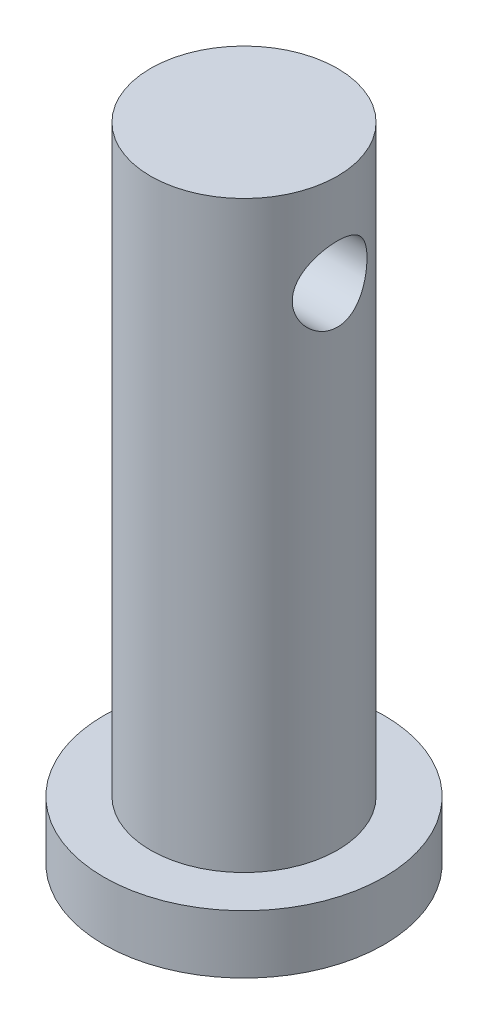
ISO-10303-21;
HEADER;
FILE_DESCRIPTION(('STEP AP214'),'2;1');
FILE_NAME('part.step','',(''),(''),'','','');
FILE_SCHEMA(('AUTOMOTIVE_DESIGN { 1 0 10303 214 1 1 1 1 }'));
ENDSEC;
DATA;
#1=APPLICATION_CONTEXT('core data for automotive mechanical design processes');
#2=APPLICATION_PROTOCOL_DEFINITION('international standard','automotive_design',2000,#1);
#3=PRODUCT_CONTEXT('',#1,'mechanical');
#4=PRODUCT('Part','Part','',(#3));
#5=PRODUCT_RELATED_PRODUCT_CATEGORY('part','',(#4));
#6=PRODUCT_DEFINITION_FORMATION('','',#4);
#7=PRODUCT_DEFINITION_CONTEXT('part definition',#1,'design');
#8=PRODUCT_DEFINITION('design','',#6,#7);
#9=PRODUCT_DEFINITION_SHAPE('','',#8);
#10=(LENGTH_UNIT() NAMED_UNIT(*) SI_UNIT(.MILLI.,.METRE.));
#11=(NAMED_UNIT(*) PLANE_ANGLE_UNIT() SI_UNIT($,.RADIAN.));
#12=(NAMED_UNIT(*) SI_UNIT($,.STERADIAN.) SOLID_ANGLE_UNIT());
#13=UNCERTAINTY_MEASURE_WITH_UNIT(LENGTH_MEASURE(1.E-05),#10,'distance_accuracy_value','');
#14=(GEOMETRIC_REPRESENTATION_CONTEXT(3) GLOBAL_UNCERTAINTY_ASSIGNED_CONTEXT((#13)) GLOBAL_UNIT_ASSIGNED_CONTEXT((#10,
#11,#12)) REPRESENTATION_CONTEXT('',''));
#15=CARTESIAN_POINT('',(0.,0.,0.));
#16=DIRECTION('',(0.,0.,1.));
#17=DIRECTION('',(1.,0.,0.));
#18=AXIS2_PLACEMENT_3D('',#15,#16,#17);
#19=CARTESIAN_POINT('',(0.,2.5,0.));
#20=DIRECTION('',(0.,-1.,0.));
#21=DIRECTION('',(0.,0.,-1.));
#22=AXIS2_PLACEMENT_3D('',#19,#20,#21);
#23=CYLINDRICAL_SURFACE('',#22,6.);
#24=CARTESIAN_POINT('',(0.,2.5,0.));
#25=DIRECTION('',(0.,1.,0.));
#26=DIRECTION('',(0.,0.,1.));
#27=AXIS2_PLACEMENT_3D('',#24,#25,#26);
#28=CIRCLE('',#27,6.);
#29=CARTESIAN_POINT('',(0.,2.5,6.));
#30=VERTEX_POINT('',#29);
#31=EDGE_CURVE('E49',#30,#30,#28,.T.);
#32=ORIENTED_EDGE('',*,*,#31,.F.);
#33=EDGE_LOOP('',(#32));
#34=FACE_BOUND('',#33,.T.);
#35=CARTESIAN_POINT('',(0.,0.,0.));
#36=DIRECTION('',(0.,1.,0.));
#37=DIRECTION('',(0.,0.,1.));
#38=AXIS2_PLACEMENT_3D('',#35,#36,#37);
#39=CIRCLE('',#38,6.);
#40=CARTESIAN_POINT('',(0.,0.,6.));
#41=VERTEX_POINT('',#40);
#42=EDGE_CURVE('E54',#41,#41,#39,.T.);
#43=ORIENTED_EDGE('',*,*,#42,.T.);
#44=EDGE_LOOP('',(#43));
#45=FACE_BOUND('',#44,.T.);
#46=ADVANCED_FACE('F37',(#34,#45),#23,.T.);
#47=CARTESIAN_POINT('',(0.,2.5,0.));
#48=DIRECTION('',(0.,1.,0.));
#49=DIRECTION('',(0.,0.,1.));
#50=AXIS2_PLACEMENT_3D('',#47,#48,#49);
#51=PLANE('',#50);
#52=CARTESIAN_POINT('',(0.,2.5,0.));
#53=DIRECTION('',(0.,1.,0.));
#54=DIRECTION('',(0.,0.,1.));
#55=AXIS2_PLACEMENT_3D('',#52,#53,#54);
#56=CIRCLE('',#55,4.);
#57=CARTESIAN_POINT('',(0.,2.5,4.));
#58=VERTEX_POINT('',#57);
#59=EDGE_CURVE('E10',#58,#58,#56,.T.);
#60=ORIENTED_EDGE('',*,*,#59,.F.);
#61=EDGE_LOOP('',(#60));
#62=FACE_BOUND('',#61,.T.);
#63=ORIENTED_EDGE('',*,*,#31,.T.);
#64=EDGE_LOOP('',(#63));
#65=FACE_BOUND('',#64,.T.);
#66=ADVANCED_FACE('F85',(#62,#65),#51,.T.);
#67=CARTESIAN_POINT('',(0.,0.,0.));
#68=DIRECTION('',(0.,1.,0.));
#69=DIRECTION('',(0.,0.,1.));
#70=AXIS2_PLACEMENT_3D('',#67,#68,#69);
#71=PLANE('',#70);
#72=ORIENTED_EDGE('',*,*,#42,.F.);
#73=EDGE_LOOP('',(#72));
#74=FACE_BOUND('',#73,.T.);
#75=ADVANCED_FACE('F81',(#74),#71,.F.);
#76=CARTESIAN_POINT('',(0.,27.5,0.));
#77=DIRECTION('',(0.,-1.,0.));
#78=DIRECTION('',(0.,0.,-1.));
#79=AXIS2_PLACEMENT_3D('',#76,#77,#78);
#80=CYLINDRICAL_SURFACE('',#79,4.);
#81=CARTESIAN_POINT('',(-3.66606055596467,23.5,-1.6));
#82=CARTESIAN_POINT('',(-3.66606921325137,23.5857115984799,-1.59999060336303));
#83=CARTESIAN_POINT('',(-3.66910881987412,23.6715444277638,-1.59307185487548));
#84=CARTESIAN_POINT('',(-3.68088731350276,23.8407478663017,-1.56565522447418));
#85=CARTESIAN_POINT('',(-3.68964076309481,23.9241116136644,-1.5451226435537));
#86=CARTESIAN_POINT('',(-3.71168364633037,24.085642353576,-1.49138802605496));
#87=CARTESIAN_POINT('',(-3.72495597085692,24.1638276378882,-1.45823372202034));
#88=CARTESIAN_POINT('',(-3.75451732076224,24.3135080406877,-1.38033621549729));
#89=CARTESIAN_POINT('',(-3.77080568723138,24.3850046153207,-1.335595543414));
#90=CARTESIAN_POINT('',(-3.80560692040826,24.5234083217932,-1.23305757966994));
#91=CARTESIAN_POINT('',(-3.82419134366997,24.5898851383436,-1.17470348618186));
#92=CARTESIAN_POINT('',(-3.86089965583049,24.7124231978523,-1.04776728461923));
#93=CARTESIAN_POINT('',(-3.87902338189098,24.7684808010319,-0.979181617340543));
#94=CARTESIAN_POINT('',(-3.91362726325484,24.8707251175862,-0.830405048285101));
#95=CARTESIAN_POINT('',(-3.93001442946855,24.9164354411765,-0.749863172489824));
#96=CARTESIAN_POINT('',(-3.95843142105237,24.9934748547118,-0.581460258300095));
#97=CARTESIAN_POINT('',(-3.97046301907739,25.0248097966256,-0.493602215430369));
#98=CARTESIAN_POINT('',(-3.98830660006628,25.0706731891499,-0.317573141471113));
#99=CARTESIAN_POINT('',(-3.99439149420286,25.0859418512712,-0.229623187843684));
#100=CARTESIAN_POINT('',(-4.00064248546163,25.1016227885302,-0.0522130629101201));
#101=CARTESIAN_POINT('',(-4.0008107901545,25.1020406047479,0.037246532660323));
#102=CARTESIAN_POINT('',(-3.99537570257429,25.08841378418,0.20978599577225));
#103=CARTESIAN_POINT('',(-3.99009597417469,25.0751801818025,0.292941962299228));
#104=CARTESIAN_POINT('',(-3.97479433175032,25.0360056989514,0.455738487374672));
#105=CARTESIAN_POINT('',(-3.9647720697689,25.0100638860797,0.535378787512128));
#106=CARTESIAN_POINT('',(-3.9407745956616,24.945890813699,0.690318350809325));
#107=CARTESIAN_POINT('',(-3.9267420837344,24.9074802281476,0.765534098703708));
#108=CARTESIAN_POINT('',(-3.89611668143758,24.8196279944648,0.90864652059246));
#109=CARTESIAN_POINT('',(-3.87952291412059,24.7701825655219,0.976540674172887));
#110=CARTESIAN_POINT('',(-3.84417309742667,24.6578806912427,1.10781506239372));
#111=CARTESIAN_POINT('',(-3.82534661216192,24.5943568859329,1.17060627621891));
#112=CARTESIAN_POINT('',(-3.78849328771823,24.4576075425432,1.28488593230826));
#113=CARTESIAN_POINT('',(-3.77046671181078,24.3843788414767,1.33637067500772));
#114=CARTESIAN_POINT('',(-3.7367751795345,24.2276647820728,1.42792335099434));
#115=CARTESIAN_POINT('',(-3.72119131345105,24.1439481356129,1.46762772138792));
#116=CARTESIAN_POINT('',(-3.69510072373859,23.9702276076304,1.53214100797301));
#117=CARTESIAN_POINT('',(-3.68459070338672,23.8802278521833,1.55695959872352));
#118=CARTESIAN_POINT('',(-3.67063807738052,23.7023713780512,1.58956395906557));
#119=CARTESIAN_POINT('',(-3.6668029315846,23.6147196423039,1.59829767744673));
#120=CARTESIAN_POINT('',(-3.66551598301679,23.4391382337856,1.60124906115921));
#121=CARTESIAN_POINT('',(-3.6680622444997,23.3512086533777,1.59547112847431));
#122=CARTESIAN_POINT('',(-3.67884835485706,23.1828328520361,1.57042631583082));
#123=CARTESIAN_POINT('',(-3.68675566238216,23.1022456500804,1.55194644961876));
#124=CARTESIAN_POINT('',(-3.70696040822297,22.9453692761712,1.50304334952902));
#125=CARTESIAN_POINT('',(-3.71925881990995,22.8690810615141,1.47261746744191));
#126=CARTESIAN_POINT('',(-3.7474702548796,22.7195181137636,1.39930851158516));
#127=CARTESIAN_POINT('',(-3.76350963711308,22.6464910490444,1.35597029461167));
#128=CARTESIAN_POINT('',(-3.7972030812627,22.5084136100467,1.2585321795535));
#129=CARTESIAN_POINT('',(-3.8148577991685,22.4433665017635,1.20442789878559));
#130=CARTESIAN_POINT('',(-3.85136732777118,22.3181012731206,1.08227536934438));
#131=CARTESIAN_POINT('',(-3.87021445828162,22.2585947477672,1.01349234355608));
#132=CARTESIAN_POINT('',(-3.9057583565405,22.1518583387117,0.866466906695073));
#133=CARTESIAN_POINT('',(-3.92245503674592,22.1046289547222,0.788224110774288));
#134=CARTESIAN_POINT('',(-3.95186972720228,22.023961898831,0.624223947201406));
#135=CARTESIAN_POINT('',(-3.96458868992219,21.9905209246674,0.53846838479525));
#136=CARTESIAN_POINT('',(-3.98458170775432,21.9387609180739,0.361914872735378));
#137=CARTESIAN_POINT('',(-3.99185871766035,21.9204336788479,0.271119688235413));
#138=CARTESIAN_POINT('',(-3.9998320656841,21.9003962386997,0.0934532082770405));
#139=CARTESIAN_POINT('',(-4.00092677395898,21.8976798972299,0.0067123940744425));
#140=CARTESIAN_POINT('',(-3.99748833902874,21.9062843834273,-0.165947068586596));
#141=CARTESIAN_POINT('',(-3.9929560477353,21.9176030862285,-0.251865839515699));
#142=CARTESIAN_POINT('',(-3.97897210691404,21.9532374306868,-0.41773672155713));
#143=CARTESIAN_POINT('',(-3.96967584507464,21.9771431568604,-0.497791043718709));
#144=CARTESIAN_POINT('',(-3.9471595826563,22.0368422436495,-0.652737883807153));
#145=CARTESIAN_POINT('',(-3.93393885843209,22.0726377968163,-0.727629446613821));
#146=CARTESIAN_POINT('',(-3.90414475488046,22.1568825587915,-0.873762433484893));
#147=CARTESIAN_POINT('',(-3.88744903782584,22.2058210359081,-0.944696309445141));
#148=CARTESIAN_POINT('',(-3.85271522549158,22.3142308153431,-1.07764322281926));
#149=CARTESIAN_POINT('',(-3.834676576404,22.3737064771681,-1.13965254859661));
#150=CARTESIAN_POINT('',(-3.79790210847538,22.50585217962,-1.25696101206879));
#151=CARTESIAN_POINT('',(-3.77919226084307,22.5791110987209,-1.31160710975922));
#152=CARTESIAN_POINT('',(-3.74439737180144,22.734353709943,-1.40787796035152));
#153=CARTESIAN_POINT('',(-3.72831263909964,22.8163384263279,-1.44950118231999));
#154=CARTESIAN_POINT('',(-3.70207091566326,22.9792297614785,-1.51519287013865));
#155=CARTESIAN_POINT('',(-3.69151134889319,23.0595721878009,-1.54050201133136));
#156=CARTESIAN_POINT('',(-3.67556802883171,23.2235883357043,-1.57817420625471));
#157=CARTESIAN_POINT('',(-3.6701698565774,23.3072520927736,-1.59057333431041));
#158=CARTESIAN_POINT('',(-3.66659567006108,23.4275020498703,-1.59877140664814));
#159=CARTESIAN_POINT('',(-3.66605689354686,23.4637401767981,-1.6000039751959));
#160=CARTESIAN_POINT('',(-3.66606055596467,23.5,-1.6));
#161=B_SPLINE_CURVE_WITH_KNOTS('',3,(#81,#82,#83,#84,#85,#86,#87,#88,#89,#90,#91,#92,#93,#94,
#95,#96,#97,#98,#99,#100,#101,#102,#103,#104,#105,#106,#107,#108,#109,#110,#111,#112,#113,#114,
#115,#116,#117,#118,#119,#120,#121,#122,#123,#124,#125,#126,#127,#128,#129,#130,#131,#132,#133,
#134,#135,#136,#137,#138,#139,#140,#141,#142,#143,#144,#145,#146,#147,#148,#149,#150,#151,#152,
#153,#154,#155,#156,#157,#158,#159,#160),.UNSPECIFIED.,.T.,.F.,(4,2,2,2,2,2,2,2,2,2,2,2,2,2,2,2,
2,2,2,2,2,2,2,2,2,2,2,2,2,2,2,2,2,2,2,2,2,2,2,4),(0.,0.257022119014121,0.514701868657797,
0.771416658634708,1.02807543059089,1.2980449462754,1.56810859478674,1.84882135273143,
2.12941973575584,2.39643346309747,2.66334756244538,2.91526915864242,3.16720924103248,
3.42294640187919,3.67877131952025,3.95139235265084,4.22410245701701,4.50451566971661,
4.78474643835289,5.04785718014745,5.3108881192156,5.55893798463324,5.80704286916518,
6.06520923717368,6.32348091615887,6.60082987392791,6.87819011877406,7.15548389845457,
7.43262700758517,7.6916883179997,7.95071041205289,8.20177595549889,8.45288782258076,
8.71509640907148,8.97741373246573,9.25597002623699,9.53455905402558,9.78813328650469,
10.040997041706,10.1497288441659),.UNSPECIFIED.);
#162=CARTESIAN_POINT('',(-3.66606055596467,23.5,-1.6));
#163=VERTEX_POINT('',#162);
#164=EDGE_CURVE('E40',#163,#163,#161,.T.);
#165=ORIENTED_EDGE('',*,*,#164,.T.);
#166=EDGE_LOOP('',(#165));
#167=FACE_BOUND('',#166,.T.);
#168=CARTESIAN_POINT('',(3.66606055596467,23.5,-1.6));
#169=CARTESIAN_POINT('',(3.66606921325137,23.4142884015201,-1.59999060336303));
#170=CARTESIAN_POINT('',(3.66910881987412,23.3284555722362,-1.59307185487548));
#171=CARTESIAN_POINT('',(3.68088731350276,23.1592521336983,-1.56565522447418));
#172=CARTESIAN_POINT('',(3.68964076309481,23.0758883863356,-1.5451226435537));
#173=CARTESIAN_POINT('',(3.71168364633037,22.914357646424,-1.49138802605496));
#174=CARTESIAN_POINT('',(3.72495597085692,22.8361723621118,-1.45823372202034));
#175=CARTESIAN_POINT('',(3.75451732076224,22.6864919593123,-1.38033621549729));
#176=CARTESIAN_POINT('',(3.77080568723138,22.6149953846793,-1.335595543414));
#177=CARTESIAN_POINT('',(3.80560692040826,22.4765916782068,-1.23305757966994));
#178=CARTESIAN_POINT('',(3.82419134366997,22.4101148616564,-1.17470348618186));
#179=CARTESIAN_POINT('',(3.86089965583049,22.2875768021477,-1.04776728461923));
#180=CARTESIAN_POINT('',(3.87902338189098,22.2315191989681,-0.979181617340543));
#181=CARTESIAN_POINT('',(3.91362726325484,22.1292748824138,-0.830405048285102));
#182=CARTESIAN_POINT('',(3.93001442946855,22.0835645588235,-0.749863172489825));
#183=CARTESIAN_POINT('',(3.95843142105237,22.0065251452882,-0.581460258300096));
#184=CARTESIAN_POINT('',(3.97046301907739,21.9751902033744,-0.493602215430369));
#185=CARTESIAN_POINT('',(3.98830660006628,21.9293268108501,-0.317573141471113));
#186=CARTESIAN_POINT('',(3.99439149420286,21.9140581487288,-0.229623187843684));
#187=CARTESIAN_POINT('',(4.00064248546163,21.8983772114698,-0.0522130629101201));
#188=CARTESIAN_POINT('',(4.0008107901545,21.8979593952521,0.037246532660323));
#189=CARTESIAN_POINT('',(3.99537570257429,21.91158621582,0.20978599577225));
#190=CARTESIAN_POINT('',(3.99009597417469,21.9248198181975,0.292941962299228));
#191=CARTESIAN_POINT('',(3.97479433175032,21.9639943010486,0.455738487374672));
#192=CARTESIAN_POINT('',(3.9647720697689,21.9899361139203,0.535378787512128));
#193=CARTESIAN_POINT('',(3.9407745956616,22.054109186301,0.690318350809326));
#194=CARTESIAN_POINT('',(3.9267420837344,22.0925197718524,0.765534098703708));
#195=CARTESIAN_POINT('',(3.89611668143758,22.1803720055352,0.90864652059246));
#196=CARTESIAN_POINT('',(3.87952291412059,22.2298174344781,0.976540674172888));
#197=CARTESIAN_POINT('',(3.84417309742667,22.3421193087573,1.10781506239372));
#198=CARTESIAN_POINT('',(3.82534661216192,22.4056431140671,1.17060627621891));
#199=CARTESIAN_POINT('',(3.78849328771823,22.5423924574568,1.28488593230826));
#200=CARTESIAN_POINT('',(3.77046671181078,22.6156211585233,1.33637067500773));
#201=CARTESIAN_POINT('',(3.7367751795345,22.7723352179272,1.42792335099435));
#202=CARTESIAN_POINT('',(3.72119131345105,22.8560518643871,1.46762772138792));
#203=CARTESIAN_POINT('',(3.69510072373859,23.0297723923696,1.53214100797301));
#204=CARTESIAN_POINT('',(3.68459070338672,23.1197721478167,1.55695959872352));
#205=CARTESIAN_POINT('',(3.67063807738052,23.2976286219488,1.58956395906557));
#206=CARTESIAN_POINT('',(3.6668029315846,23.3852803576961,1.59829767744673));
#207=CARTESIAN_POINT('',(3.66551598301679,23.5608617662144,1.60124906115921));
#208=CARTESIAN_POINT('',(3.6680622444997,23.6487913466223,1.59547112847431));
#209=CARTESIAN_POINT('',(3.67884835485706,23.8171671479639,1.57042631583082));
#210=CARTESIAN_POINT('',(3.68675566238216,23.8977543499196,1.55194644961876));
#211=CARTESIAN_POINT('',(3.70696040822297,24.0546307238288,1.50304334952902));
#212=CARTESIAN_POINT('',(3.71925881990995,24.1309189384859,1.47261746744191));
#213=CARTESIAN_POINT('',(3.7474702548796,24.2804818862364,1.39930851158516));
#214=CARTESIAN_POINT('',(3.76350963711308,24.3535089509556,1.35597029461167));
#215=CARTESIAN_POINT('',(3.7972030812627,24.4915863899533,1.2585321795535));
#216=CARTESIAN_POINT('',(3.8148577991685,24.5566334982365,1.20442789878558));
#217=CARTESIAN_POINT('',(3.85136732777118,24.6818987268794,1.08227536934438));
#218=CARTESIAN_POINT('',(3.87021445828162,24.7414052522328,1.01349234355608));
#219=CARTESIAN_POINT('',(3.9057583565405,24.8481416612883,0.866466906695073));
#220=CARTESIAN_POINT('',(3.92245503674592,24.8953710452778,0.788224110774288));
#221=CARTESIAN_POINT('',(3.95186972720228,24.976038101169,0.624223947201406));
#222=CARTESIAN_POINT('',(3.96458868992219,25.0094790753326,0.53846838479525));
#223=CARTESIAN_POINT('',(3.98458170775432,25.0612390819261,0.361914872735378));
#224=CARTESIAN_POINT('',(3.99185871766035,25.0795663211521,0.271119688235414));
#225=CARTESIAN_POINT('',(3.9998320656841,25.0996037613003,0.0934532082770406));
#226=CARTESIAN_POINT('',(4.00092677395898,25.1023201027701,0.00671239407444235));
#227=CARTESIAN_POINT('',(3.99748833902874,25.0937156165727,-0.165947068586597));
#228=CARTESIAN_POINT('',(3.9929560477353,25.0823969137715,-0.251865839515699));
#229=CARTESIAN_POINT('',(3.97897210691404,25.0467625693132,-0.417736721557131));
#230=CARTESIAN_POINT('',(3.96967584507464,25.0228568431396,-0.49779104371871));
#231=CARTESIAN_POINT('',(3.9471595826563,24.9631577563505,-0.652737883807154));
#232=CARTESIAN_POINT('',(3.93393885843209,24.9273622031837,-0.727629446613822));
#233=CARTESIAN_POINT('',(3.90414475488046,24.8431174412085,-0.873762433484893));
#234=CARTESIAN_POINT('',(3.88744903782584,24.7941789640919,-0.944696309445142));
#235=CARTESIAN_POINT('',(3.85271522549158,24.6857691846569,-1.07764322281926));
#236=CARTESIAN_POINT('',(3.834676576404,24.6262935228319,-1.13965254859661));
#237=CARTESIAN_POINT('',(3.79790210847538,24.49414782038,-1.25696101206879));
#238=CARTESIAN_POINT('',(3.77919226084307,24.4208889012791,-1.31160710975922));
#239=CARTESIAN_POINT('',(3.74439737180144,24.265646290057,-1.40787796035152));
#240=CARTESIAN_POINT('',(3.72831263909964,24.1836615736721,-1.44950118231999));
#241=CARTESIAN_POINT('',(3.70207091566326,24.0207702385215,-1.51519287013865));
#242=CARTESIAN_POINT('',(3.69151134889319,23.9404278121991,-1.54050201133137));
#243=CARTESIAN_POINT('',(3.67556802883171,23.7764116642957,-1.57817420625471));
#244=CARTESIAN_POINT('',(3.6701698565774,23.6927479072264,-1.59057333431041));
#245=CARTESIAN_POINT('',(3.66659567006108,23.5724979501297,-1.59877140664814));
#246=CARTESIAN_POINT('',(3.66605689354686,23.5362598232019,-1.6000039751959));
#247=CARTESIAN_POINT('',(3.66606055596467,23.5,-1.6));
#248=B_SPLINE_CURVE_WITH_KNOTS('',3,(#168,#169,#170,#171,#172,#173,#174,#175,#176,#177,#178,
#179,#180,#181,#182,#183,#184,#185,#186,#187,#188,#189,#190,#191,#192,#193,#194,#195,#196,#197,
#198,#199,#200,#201,#202,#203,#204,#205,#206,#207,#208,#209,#210,#211,#212,#213,#214,#215,#216,
#217,#218,#219,#220,#221,#222,#223,#224,#225,#226,#227,#228,#229,#230,#231,#232,#233,#234,#235,
#236,#237,#238,#239,#240,#241,#242,#243,#244,#245,#246,#247),.UNSPECIFIED.,.T.,.F.,(4,2,2,2,2,2,
2,2,2,2,2,2,2,2,2,2,2,2,2,2,2,2,2,2,2,2,2,2,2,2,2,2,2,2,2,2,2,2,2,4),(0.,0.257022119014121,
0.514701868657797,0.771416658634708,1.02807543059089,1.2980449462754,1.56810859478674,
1.84882135273142,2.12941973575584,2.39643346309747,2.66334756244538,2.91526915864242,
3.16720924103248,3.42294640187919,3.67877131952025,3.95139235265084,4.22410245701702,
4.50451566971661,4.78474643835289,5.04785718014745,5.3108881192156,5.55893798463324,
5.80704286916518,6.06520923717368,6.32348091615887,6.60082987392791,6.87819011877406,
7.15548389845457,7.43262700758517,7.6916883179997,7.95071041205289,8.20177595549889,
8.45288782258076,8.71509640907148,8.97741373246572,9.25597002623698,9.53455905402558,
9.78813328650469,10.040997041706,10.1497288441659),.UNSPECIFIED.);
#249=CARTESIAN_POINT('',(3.66606055596467,23.5,-1.6));
#250=VERTEX_POINT('',#249);
#251=EDGE_CURVE('E60',#250,#250,#248,.T.);
#252=ORIENTED_EDGE('',*,*,#251,.T.);
#253=EDGE_LOOP('',(#252));
#254=FACE_BOUND('',#253,.T.);
#255=CARTESIAN_POINT('',(0.,27.5,0.));
#256=DIRECTION('',(0.,1.,0.));
#257=DIRECTION('',(0.,0.,1.));
#258=AXIS2_PLACEMENT_3D('',#255,#256,#257);
#259=CIRCLE('',#258,4.);
#260=CARTESIAN_POINT('',(0.,27.5,4.));
#261=VERTEX_POINT('',#260);
#262=EDGE_CURVE('E57',#261,#261,#259,.T.);
#263=ORIENTED_EDGE('',*,*,#262,.F.);
#264=EDGE_LOOP('',(#263));
#265=FACE_BOUND('',#264,.T.);
#266=ORIENTED_EDGE('',*,*,#59,.T.);
#267=EDGE_LOOP('',(#266));
#268=FACE_BOUND('',#267,.T.);
#269=ADVANCED_FACE('F65',(#167,#254,#265,#268),#80,.T.);
#270=CARTESIAN_POINT('',(0.,27.5,0.));
#271=DIRECTION('',(0.,1.,0.));
#272=DIRECTION('',(0.,0.,1.));
#273=AXIS2_PLACEMENT_3D('',#270,#271,#272);
#274=PLANE('',#273);
#275=ORIENTED_EDGE('',*,*,#262,.T.);
#276=EDGE_LOOP('',(#275));
#277=FACE_BOUND('',#276,.T.);
#278=ADVANCED_FACE('F72',(#277),#274,.T.);
#279=CARTESIAN_POINT('',(-6.,23.5,0.));
#280=DIRECTION('',(1.,0.,0.));
#281=DIRECTION('',(0.,0.,-1.));
#282=AXIS2_PLACEMENT_3D('',#279,#280,#281);
#283=CYLINDRICAL_SURFACE('',#282,1.6);
#284=ORIENTED_EDGE('',*,*,#251,.F.);
#285=EDGE_LOOP('',(#284));
#286=FACE_BOUND('',#285,.T.);
#287=ORIENTED_EDGE('',*,*,#164,.F.);
#288=EDGE_LOOP('',(#287));
#289=FACE_BOUND('',#288,.T.);
#290=ADVANCED_FACE('F69',(#286,#289),#283,.F.);
#291=CLOSED_SHELL('',(#46,#66,#75,#269,#278,#290));
#292=MANIFOLD_SOLID_BREP('B2',#291);
#293=ADVANCED_BREP_SHAPE_REPRESENTATION('',(#18,#292),#14);
#294=SHAPE_DEFINITION_REPRESENTATION(#9,#293);
ENDSEC;
END-ISO-10303-21;
